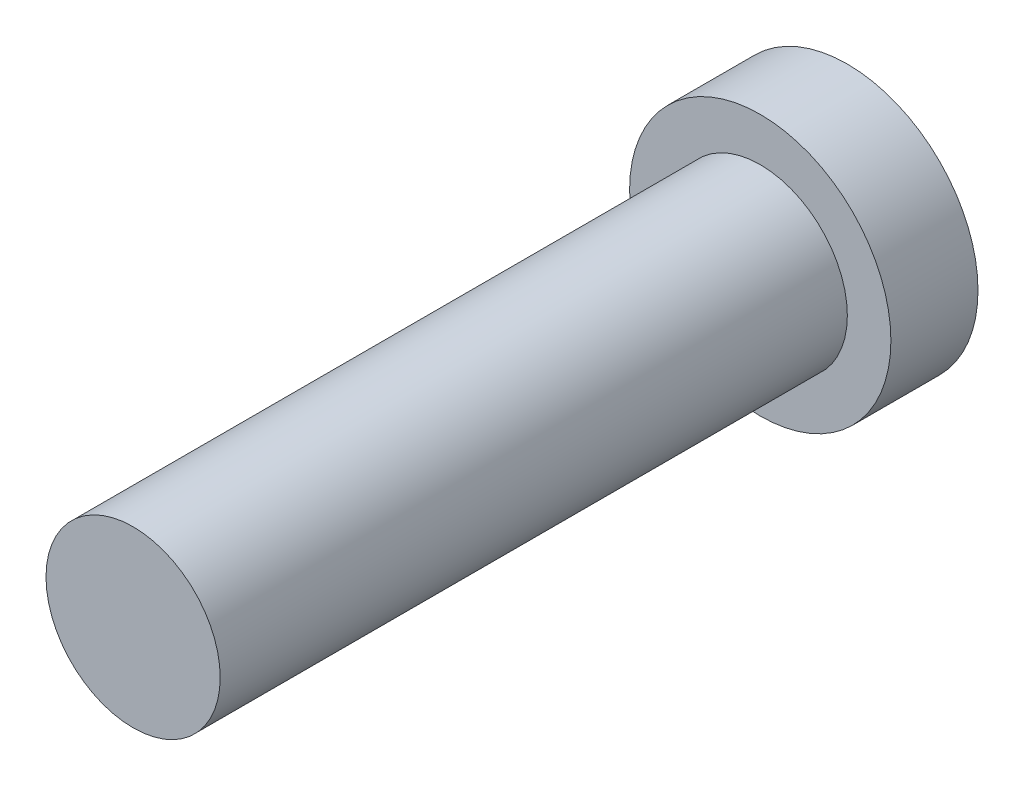
ISO-10303-21;
HEADER;
FILE_DESCRIPTION(('STEP AP214'),'2;1');
FILE_NAME('part.step','',(''),(''),'','','');
FILE_SCHEMA(('AUTOMOTIVE_DESIGN { 1 0 10303 214 1 1 1 1 }'));
ENDSEC;
DATA;
#1=APPLICATION_CONTEXT('core data for automotive mechanical design processes');
#2=APPLICATION_PROTOCOL_DEFINITION('international standard','automotive_design',2000,#1);
#3=PRODUCT_CONTEXT('',#1,'mechanical');
#4=PRODUCT('Part','Part','',(#3));
#5=PRODUCT_RELATED_PRODUCT_CATEGORY('part','',(#4));
#6=PRODUCT_DEFINITION_FORMATION('','',#4);
#7=PRODUCT_DEFINITION_CONTEXT('part definition',#1,'design');
#8=PRODUCT_DEFINITION('design','',#6,#7);
#9=PRODUCT_DEFINITION_SHAPE('','',#8);
#10=(LENGTH_UNIT() NAMED_UNIT(*) SI_UNIT(.MILLI.,.METRE.));
#11=(NAMED_UNIT(*) PLANE_ANGLE_UNIT() SI_UNIT($,.RADIAN.));
#12=(NAMED_UNIT(*) SI_UNIT($,.STERADIAN.) SOLID_ANGLE_UNIT());
#13=UNCERTAINTY_MEASURE_WITH_UNIT(LENGTH_MEASURE(1.E-05),#10,'distance_accuracy_value','');
#14=(GEOMETRIC_REPRESENTATION_CONTEXT(3) GLOBAL_UNCERTAINTY_ASSIGNED_CONTEXT((#13)) GLOBAL_UNIT_ASSIGNED_CONTEXT((#10,
#11,#12)) REPRESENTATION_CONTEXT('',''));
#15=CARTESIAN_POINT('',(0.,0.,0.));
#16=DIRECTION('',(0.,0.,1.));
#17=DIRECTION('',(1.,0.,0.));
#18=AXIS2_PLACEMENT_3D('',#15,#16,#17);
#19=CARTESIAN_POINT('',(0.,0.,36.));
#20=DIRECTION('',(0.,0.,-1.));
#21=DIRECTION('',(-1.,0.,0.));
#22=AXIS2_PLACEMENT_3D('',#19,#20,#21);
#23=CYLINDRICAL_SURFACE('',#22,5.);
#24=CARTESIAN_POINT('',(0.,0.,36.));
#25=DIRECTION('',(0.,0.,1.));
#26=DIRECTION('',(1.,0.,0.));
#27=AXIS2_PLACEMENT_3D('',#24,#25,#26);
#28=CIRCLE('',#27,5.);
#29=CARTESIAN_POINT('',(5.,0.,36.));
#30=VERTEX_POINT('',#29);
#31=EDGE_CURVE('E10',#30,#30,#28,.T.);
#32=ORIENTED_EDGE('',*,*,#31,.F.);
#33=EDGE_LOOP('',(#32));
#34=FACE_BOUND('',#33,.T.);
#35=CARTESIAN_POINT('',(0.,0.,0.));
#36=DIRECTION('',(0.,0.,1.));
#37=DIRECTION('',(1.,0.,0.));
#38=AXIS2_PLACEMENT_3D('',#35,#36,#37);
#39=CIRCLE('',#38,5.);
#40=CARTESIAN_POINT('',(5.,0.,0.));
#41=VERTEX_POINT('',#40);
#42=EDGE_CURVE('E36',#41,#41,#39,.T.);
#43=ORIENTED_EDGE('',*,*,#42,.T.);
#44=EDGE_LOOP('',(#43));
#45=FACE_BOUND('',#44,.T.);
#46=ADVANCED_FACE('F33',(#34,#45),#23,.T.);
#47=CARTESIAN_POINT('',(0.,0.,36.));
#48=DIRECTION('',(0.,0.,1.));
#49=DIRECTION('',(1.,0.,0.));
#50=AXIS2_PLACEMENT_3D('',#47,#48,#49);
#51=PLANE('',#50);
#52=ORIENTED_EDGE('',*,*,#31,.T.);
#53=EDGE_LOOP('',(#52));
#54=FACE_BOUND('',#53,.T.);
#55=ADVANCED_FACE('F56',(#54),#51,.T.);
#56=CARTESIAN_POINT('',(0.,0.,-5.));
#57=DIRECTION('',(0.,0.,1.));
#58=DIRECTION('',(1.,0.,0.));
#59=AXIS2_PLACEMENT_3D('',#56,#57,#58);
#60=CYLINDRICAL_SURFACE('',#59,7.5);
#61=CARTESIAN_POINT('',(0.,0.,-5.));
#62=DIRECTION('',(0.,0.,-1.));
#63=DIRECTION('',(-1.,0.,0.));
#64=AXIS2_PLACEMENT_3D('',#61,#62,#63);
#65=CIRCLE('',#64,7.5);
#66=CARTESIAN_POINT('',(-7.5,0.,-5.));
#67=VERTEX_POINT('',#66);
#68=EDGE_CURVE('E43',#67,#67,#65,.T.);
#69=ORIENTED_EDGE('',*,*,#68,.F.);
#70=EDGE_LOOP('',(#69));
#71=FACE_BOUND('',#70,.T.);
#72=CARTESIAN_POINT('',(0.,0.,0.));
#73=DIRECTION('',(0.,0.,-1.));
#74=DIRECTION('',(-1.,0.,0.));
#75=AXIS2_PLACEMENT_3D('',#72,#73,#74);
#76=CIRCLE('',#75,7.5);
#77=CARTESIAN_POINT('',(-7.5,0.,0.));
#78=VERTEX_POINT('',#77);
#79=EDGE_CURVE('E45',#78,#78,#76,.T.);
#80=ORIENTED_EDGE('',*,*,#79,.T.);
#81=EDGE_LOOP('',(#80));
#82=FACE_BOUND('',#81,.T.);
#83=ADVANCED_FACE('F53',(#71,#82),#60,.T.);
#84=CARTESIAN_POINT('',(0.,0.,-5.));
#85=DIRECTION('',(0.,0.,-1.));
#86=DIRECTION('',(-1.,0.,0.));
#87=AXIS2_PLACEMENT_3D('',#84,#85,#86);
#88=PLANE('',#87);
#89=ORIENTED_EDGE('',*,*,#68,.T.);
#90=EDGE_LOOP('',(#89));
#91=FACE_BOUND('',#90,.T.);
#92=ADVANCED_FACE('F51',(#91),#88,.T.);
#93=CARTESIAN_POINT('',(0.,0.,0.));
#94=DIRECTION('',(0.,0.,-1.));
#95=DIRECTION('',(-1.,0.,0.));
#96=AXIS2_PLACEMENT_3D('',#93,#94,#95);
#97=PLANE('',#96);
#98=ORIENTED_EDGE('',*,*,#42,.F.);
#99=EDGE_LOOP('',(#98));
#100=FACE_BOUND('',#99,.T.);
#101=ORIENTED_EDGE('',*,*,#79,.F.);
#102=EDGE_LOOP('',(#101));
#103=FACE_BOUND('',#102,.T.);
#104=ADVANCED_FACE('F60',(#100,#103),#97,.F.);
#105=CLOSED_SHELL('',(#46,#55,#83,#92,#104));
#106=MANIFOLD_SOLID_BREP('B2',#105);
#107=ADVANCED_BREP_SHAPE_REPRESENTATION('',(#18,#106),#14);
#108=SHAPE_DEFINITION_REPRESENTATION(#9,#107);
ENDSEC;
END-ISO-10303-21;
